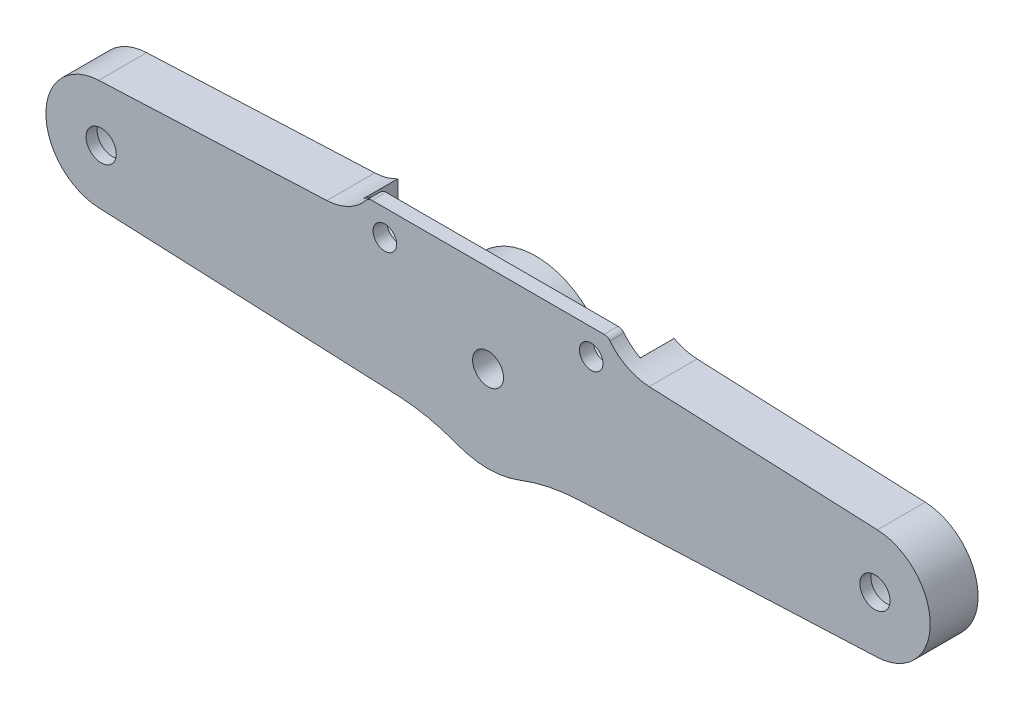
ISO-10303-21;
HEADER;
FILE_DESCRIPTION(('STEP AP214'),'2;1');
FILE_NAME('part.step','',(''),(''),'','','');
FILE_SCHEMA(('AUTOMOTIVE_DESIGN { 1 0 10303 214 1 1 1 1 }'));
ENDSEC;
DATA;
#1=APPLICATION_CONTEXT('core data for automotive mechanical design processes');
#2=APPLICATION_PROTOCOL_DEFINITION('international standard','automotive_design',2000,#1);
#3=PRODUCT_CONTEXT('',#1,'mechanical');
#4=PRODUCT('Part','Part','',(#3));
#5=PRODUCT_RELATED_PRODUCT_CATEGORY('part','',(#4));
#6=PRODUCT_DEFINITION_FORMATION('','',#4);
#7=PRODUCT_DEFINITION_CONTEXT('part definition',#1,'design');
#8=PRODUCT_DEFINITION('design','',#6,#7);
#9=PRODUCT_DEFINITION_SHAPE('','',#8);
#10=(LENGTH_UNIT() NAMED_UNIT(*) SI_UNIT(.MILLI.,.METRE.));
#11=(NAMED_UNIT(*) PLANE_ANGLE_UNIT() SI_UNIT($,.RADIAN.));
#12=(NAMED_UNIT(*) SI_UNIT($,.STERADIAN.) SOLID_ANGLE_UNIT());
#13=UNCERTAINTY_MEASURE_WITH_UNIT(LENGTH_MEASURE(1.E-05),#10,'distance_accuracy_value','');
#14=(GEOMETRIC_REPRESENTATION_CONTEXT(3) GLOBAL_UNCERTAINTY_ASSIGNED_CONTEXT((#13)) GLOBAL_UNIT_ASSIGNED_CONTEXT((#10,
#11,#12)) REPRESENTATION_CONTEXT('',''));
#15=CARTESIAN_POINT('',(0.,0.,0.));
#16=DIRECTION('',(0.,0.,1.));
#17=DIRECTION('',(1.,0.,0.));
#18=AXIS2_PLACEMENT_3D('',#15,#16,#17);
#19=CARTESIAN_POINT('',(0.,189.,-4.06854249492385));
#20=DIRECTION('',(0.,0.,1.));
#21=DIRECTION('',(1.,0.,0.));
#22=AXIS2_PLACEMENT_3D('',#19,#20,#21);
#23=CYLINDRICAL_SURFACE('',#22,17.5);
#24=CARTESIAN_POINT('',(0.,189.,52.5));
#25=DIRECTION('',(0.,0.,1.));
#26=DIRECTION('',(1.,0.,0.));
#27=AXIS2_PLACEMENT_3D('',#24,#25,#26);
#28=CIRCLE('',#27,17.5);
#29=CARTESIAN_POINT('',(17.5,189.,52.5));
#30=VERTEX_POINT('',#29);
#31=EDGE_CURVE('E400',#30,#30,#28,.T.);
#32=ORIENTED_EDGE('',*,*,#31,.F.);
#33=EDGE_LOOP('',(#32));
#34=FACE_BOUND('',#33,.T.);
#35=CARTESIAN_POINT('',(0.,189.,54.5));
#36=DIRECTION('',(0.,0.,1.));
#37=DIRECTION('',(1.,0.,0.));
#38=AXIS2_PLACEMENT_3D('',#35,#36,#37);
#39=CIRCLE('',#38,17.5);
#40=CARTESIAN_POINT('',(17.5,189.,54.5));
#41=VERTEX_POINT('',#40);
#42=EDGE_CURVE('E412',#41,#41,#39,.T.);
#43=ORIENTED_EDGE('',*,*,#42,.T.);
#44=EDGE_LOOP('',(#43));
#45=FACE_BOUND('',#44,.T.);
#46=ADVANCED_FACE('F37',(#34,#45),#23,.F.);
#47=CARTESIAN_POINT('',(0.,190.925,61.7));
#48=DIRECTION('',(0.,0.,-1.));
#49=DIRECTION('',(-1.,0.,0.));
#50=AXIS2_PLACEMENT_3D('',#47,#48,#49);
#51=PLANE('',#50);
#52=CARTESIAN_POINT('',(28.,205.85,61.7));
#53=DIRECTION('',(0.,0.,-1.));
#54=DIRECTION('',(-1.,0.,0.));
#55=AXIS2_PLACEMENT_3D('',#52,#53,#54);
#56=CIRCLE('',#55,3.2);
#57=CARTESIAN_POINT('',(24.8,205.85,61.7));
#58=VERTEX_POINT('',#57);
#59=EDGE_CURVE('E294',#58,#58,#56,.F.);
#60=ORIENTED_EDGE('',*,*,#59,.T.);
#61=EDGE_LOOP('',(#60));
#62=FACE_BOUND('',#61,.T.);
#63=CARTESIAN_POINT('',(-28.,205.85,61.7));
#64=DIRECTION('',(0.,0.,-1.));
#65=DIRECTION('',(-1.,0.,0.));
#66=AXIS2_PLACEMENT_3D('',#63,#64,#65);
#67=CIRCLE('',#66,3.2);
#68=CARTESIAN_POINT('',(-31.2,205.85,61.7));
#69=VERTEX_POINT('',#68);
#70=EDGE_CURVE('E291',#69,#69,#67,.F.);
#71=ORIENTED_EDGE('',*,*,#70,.T.);
#72=EDGE_LOOP('',(#71));
#73=FACE_BOUND('',#72,.T.);
#74=DIRECTION('',(-1.,0.,0.));
#75=VECTOR('',#74,1.);
#76=CARTESIAN_POINT('',(0.,199.35,61.7));
#77=LINE('',#76,#75);
#78=CARTESIAN_POINT('',(33.5,199.35,61.7));
#79=VERTEX_POINT('',#78);
#80=CARTESIAN_POINT('',(17.1136641313309,199.35,61.7));
#81=VERTEX_POINT('',#80);
#82=EDGE_CURVE('E333',#79,#81,#77,.T.);
#83=ORIENTED_EDGE('',*,*,#82,.T.);
#84=CARTESIAN_POINT('',(0.,189.,61.7));
#85=DIRECTION('',(0.,0.,-1.));
#86=DIRECTION('',(-1.,0.,0.));
#87=AXIS2_PLACEMENT_3D('',#84,#85,#86);
#88=CIRCLE('',#87,20.);
#89=CARTESIAN_POINT('',(-17.1136641313309,199.35,61.7));
#90=VERTEX_POINT('',#89);
#91=EDGE_CURVE('E406',#90,#81,#88,.T.);
#92=ORIENTED_EDGE('',*,*,#91,.F.);
#93=DIRECTION('',(-1.,0.,0.));
#94=VECTOR('',#93,1.);
#95=CARTESIAN_POINT('',(0.,199.35,61.7));
#96=LINE('',#95,#94);
#97=CARTESIAN_POINT('',(-33.5,199.35,61.7));
#98=VERTEX_POINT('',#97);
#99=EDGE_CURVE('E331',#90,#98,#96,.T.);
#100=ORIENTED_EDGE('',*,*,#99,.T.);
#101=CARTESIAN_POINT('',(-33.5,203.35,61.7));
#102=DIRECTION('',(0.,0.,1.));
#103=DIRECTION('',(1.,0.,0.));
#104=AXIS2_PLACEMENT_3D('',#101,#102,#103);
#105=CIRCLE('',#104,4.);
#106=CARTESIAN_POINT('',(-37.5,203.35,61.7));
#107=VERTEX_POINT('',#106);
#108=EDGE_CURVE('E198',#98,#107,#105,.F.);
#109=ORIENTED_EDGE('',*,*,#108,.T.);
#110=DIRECTION('',(0.,1.,0.));
#111=VECTOR('',#110,1.);
#112=CARTESIAN_POINT('',(-37.5,190.925,61.7));
#113=LINE('',#112,#111);
#114=CARTESIAN_POINT('',(-37.5000000000001,208.40608142153,61.7));
#115=VERTEX_POINT('',#114);
#116=EDGE_CURVE('E337',#107,#115,#113,.T.);
#117=ORIENTED_EDGE('',*,*,#116,.T.);
#118=CARTESIAN_POINT('',(-44.370078815034,221.175263739722,61.7));
#119=DIRECTION('',(0.,0.,1.));
#120=DIRECTION('',(1.,0.,0.));
#121=AXIS2_PLACEMENT_3D('',#118,#119,#120);
#122=CIRCLE('',#121,14.5);
#123=CARTESIAN_POINT('',(-33.0600095533376,212.101547119966,61.7));
#124=VERTEX_POINT('',#123);
#125=EDGE_CURVE('E326',#115,#124,#122,.T.);
#126=ORIENTED_EDGE('',*,*,#125,.T.);
#127=CARTESIAN_POINT('',(-31.5,210.85,61.7));
#128=DIRECTION('',(0.,0.,1.));
#129=DIRECTION('',(1.,0.,0.));
#130=AXIS2_PLACEMENT_3D('',#127,#128,#129);
#131=CIRCLE('',#130,2.);
#132=CARTESIAN_POINT('',(-31.5,212.85,61.7));
#133=VERTEX_POINT('',#132);
#134=EDGE_CURVE('E328',#133,#124,#131,.T.);
#135=ORIENTED_EDGE('',*,*,#134,.F.);
#136=DIRECTION('',(-1.,0.,0.));
#137=VECTOR('',#136,1.);
#138=CARTESIAN_POINT('',(31.5,212.85,61.7));
#139=LINE('',#138,#137);
#140=CARTESIAN_POINT('',(31.5,212.85,61.7));
#141=VERTEX_POINT('',#140);
#142=EDGE_CURVE('E351',#141,#133,#139,.T.);
#143=ORIENTED_EDGE('',*,*,#142,.F.);
#144=CARTESIAN_POINT('',(31.5,210.85,61.7));
#145=DIRECTION('',(0.,0.,1.));
#146=DIRECTION('',(1.,0.,0.));
#147=AXIS2_PLACEMENT_3D('',#144,#145,#146);
#148=CIRCLE('',#147,2.00000000000001);
#149=CARTESIAN_POINT('',(33.0600095533375,212.101547119966,61.7));
#150=VERTEX_POINT('',#149);
#151=EDGE_CURVE('E297',#150,#141,#148,.T.);
#152=ORIENTED_EDGE('',*,*,#151,.F.);
#153=CARTESIAN_POINT('',(44.370078815034,221.175263739722,61.7));
#154=DIRECTION('',(0.,0.,1.));
#155=DIRECTION('',(1.,0.,0.));
#156=AXIS2_PLACEMENT_3D('',#153,#154,#155);
#157=CIRCLE('',#156,14.5);
#158=CARTESIAN_POINT('',(37.5000000000001,208.40608142153,61.7));
#159=VERTEX_POINT('',#158);
#160=EDGE_CURVE('E300',#150,#159,#157,.T.);
#161=ORIENTED_EDGE('',*,*,#160,.T.);
#162=DIRECTION('',(0.,1.,0.));
#163=VECTOR('',#162,1.);
#164=CARTESIAN_POINT('',(37.5,190.925,61.7));
#165=LINE('',#164,#163);
#166=CARTESIAN_POINT('',(37.5,203.35,61.7));
#167=VERTEX_POINT('',#166);
#168=EDGE_CURVE('E334',#159,#167,#165,.F.);
#169=ORIENTED_EDGE('',*,*,#168,.T.);
#170=CARTESIAN_POINT('',(33.5,203.35,61.7));
#171=DIRECTION('',(0.,0.,1.));
#172=DIRECTION('',(1.,0.,0.));
#173=AXIS2_PLACEMENT_3D('',#170,#171,#172);
#174=CIRCLE('',#173,4.);
#175=EDGE_CURVE('E195',#167,#79,#174,.F.);
#176=ORIENTED_EDGE('',*,*,#175,.T.);
#177=EDGE_LOOP('',(#83,#92,#100,#109,#117,#126,#135,#143,#152,#161,#169,#176));
#178=FACE_BOUND('',#177,.T.);
#179=ADVANCED_FACE('F433',(#62,#73,#178),#51,.T.);
#180=CARTESIAN_POINT('',(105.,189.,62.5));
#181=DIRECTION('',(0.,0.,-1.));
#182=DIRECTION('',(-1.,0.,0.));
#183=AXIS2_PLACEMENT_3D('',#180,#181,#182);
#184=PLANE('',#183);
#185=CARTESIAN_POINT('',(105.,189.,62.5));
#186=DIRECTION('',(0.,0.,-1.));
#187=DIRECTION('',(0.,1.,0.));
#188=AXIS2_PLACEMENT_3D('',#185,#186,#187);
#189=CIRCLE('',#188,4.1);
#190=CARTESIAN_POINT('',(105.,193.1,62.5));
#191=VERTEX_POINT('',#190);
#192=EDGE_CURVE('E288',#191,#191,#189,.F.);
#193=ORIENTED_EDGE('',*,*,#192,.T.);
#194=EDGE_LOOP('',(#193));
#195=FACE_BOUND('',#194,.T.);
#196=CARTESIAN_POINT('',(105.,189.,62.5));
#197=DIRECTION('',(0.,0.,-1.));
#198=DIRECTION('',(-1.,0.,0.));
#199=AXIS2_PLACEMENT_3D('',#196,#197,#198);
#200=CIRCLE('',#199,11.05);
#201=CARTESIAN_POINT('',(93.95,189.,62.5));
#202=VERTEX_POINT('',#201);
#203=EDGE_CURVE('E397',#202,#202,#200,.F.);
#204=ORIENTED_EDGE('',*,*,#203,.F.);
#205=EDGE_LOOP('',(#204));
#206=FACE_BOUND('',#205,.T.);
#207=ADVANCED_FACE('F439',(#195,#206),#184,.T.);
#208=CARTESIAN_POINT('',(-33.5,203.35,52.5));
#209=DIRECTION('',(0.,0.,1.));
#210=DIRECTION('',(1.,0.,0.));
#211=AXIS2_PLACEMENT_3D('',#208,#209,#210);
#212=CYLINDRICAL_SURFACE('',#211,4.);
#213=DIRECTION('',(0.,0.,-1.));
#214=VECTOR('',#213,1.);
#215=CARTESIAN_POINT('',(-33.5,199.35,52.5));
#216=LINE('',#215,#214);
#217=CARTESIAN_POINT('',(-33.5,199.35,52.5));
#218=VERTEX_POINT('',#217);
#219=EDGE_CURVE('E230',#98,#218,#216,.T.);
#220=ORIENTED_EDGE('',*,*,#219,.T.);
#221=CARTESIAN_POINT('',(-33.5,203.35,52.5));
#222=DIRECTION('',(0.,0.,1.));
#223=DIRECTION('',(1.,0.,0.));
#224=AXIS2_PLACEMENT_3D('',#221,#222,#223);
#225=CIRCLE('',#224,4.);
#226=CARTESIAN_POINT('',(-37.5,203.35,52.5));
#227=VERTEX_POINT('',#226);
#228=EDGE_CURVE('E206',#218,#227,#225,.F.);
#229=ORIENTED_EDGE('',*,*,#228,.T.);
#230=DIRECTION('',(0.,0.,1.));
#231=VECTOR('',#230,1.);
#232=CARTESIAN_POINT('',(-37.5,203.35,52.5));
#233=LINE('',#232,#231);
#234=EDGE_CURVE('E190',#227,#107,#233,.T.);
#235=ORIENTED_EDGE('',*,*,#234,.T.);
#236=ORIENTED_EDGE('',*,*,#108,.F.);
#237=EDGE_LOOP('',(#220,#229,#235,#236));
#238=FACE_BOUND('',#237,.T.);
#239=ADVANCED_FACE('F39',(#238),#212,.F.);
#240=CARTESIAN_POINT('',(33.5,203.35,52.5));
#241=DIRECTION('',(0.,0.,1.));
#242=DIRECTION('',(1.,0.,0.));
#243=AXIS2_PLACEMENT_3D('',#240,#241,#242);
#244=CYLINDRICAL_SURFACE('',#243,4.);
#245=DIRECTION('',(0.,0.,1.));
#246=VECTOR('',#245,1.);
#247=CARTESIAN_POINT('',(37.5,203.35,52.5));
#248=LINE('',#247,#246);
#249=CARTESIAN_POINT('',(37.5,203.35,52.5));
#250=VERTEX_POINT('',#249);
#251=EDGE_CURVE('E192',#167,#250,#248,.F.);
#252=ORIENTED_EDGE('',*,*,#251,.T.);
#253=CARTESIAN_POINT('',(33.5,203.35,52.5));
#254=DIRECTION('',(0.,0.,1.));
#255=DIRECTION('',(1.,0.,0.));
#256=AXIS2_PLACEMENT_3D('',#253,#254,#255);
#257=CIRCLE('',#256,4.);
#258=CARTESIAN_POINT('',(33.5,199.35,52.5));
#259=VERTEX_POINT('',#258);
#260=EDGE_CURVE('E177',#250,#259,#257,.F.);
#261=ORIENTED_EDGE('',*,*,#260,.T.);
#262=DIRECTION('',(0.,0.,1.));
#263=VECTOR('',#262,1.);
#264=CARTESIAN_POINT('',(33.5,199.35,52.5));
#265=LINE('',#264,#263);
#266=EDGE_CURVE('E235',#259,#79,#265,.T.);
#267=ORIENTED_EDGE('',*,*,#266,.T.);
#268=ORIENTED_EDGE('',*,*,#175,.F.);
#269=EDGE_LOOP('',(#252,#261,#267,#268));
#270=FACE_BOUND('',#269,.T.);
#271=ADVANCED_FACE('F193',(#270),#244,.F.);
#272=CARTESIAN_POINT('',(17.113664131331,199.35,52.5));
#273=DIRECTION('',(0.,-1.,0.));
#274=DIRECTION('',(1.,0.,0.));
#275=AXIS2_PLACEMENT_3D('',#272,#273,#274);
#276=PLANE('',#275);
#277=DIRECTION('',(1.,0.,0.));
#278=VECTOR('',#277,1.);
#279=CARTESIAN_POINT('',(0.,199.35,52.5));
#280=LINE('',#279,#278);
#281=CARTESIAN_POINT('',(17.1136641313309,199.35,52.5));
#282=VERTEX_POINT('',#281);
#283=EDGE_CURVE('E187',#259,#282,#280,.F.);
#284=ORIENTED_EDGE('',*,*,#283,.T.);
#285=DIRECTION('',(0.,0.,1.));
#286=VECTOR('',#285,1.);
#287=CARTESIAN_POINT('',(17.1136641313309,199.35,52.5));
#288=LINE('',#287,#286);
#289=EDGE_CURVE('E231',#282,#81,#288,.T.);
#290=ORIENTED_EDGE('',*,*,#289,.T.);
#291=ORIENTED_EDGE('',*,*,#82,.F.);
#292=ORIENTED_EDGE('',*,*,#266,.F.);
#293=EDGE_LOOP('',(#284,#290,#291,#292));
#294=FACE_BOUND('',#293,.T.);
#295=ADVANCED_FACE('F548',(#294),#276,.F.);
#296=CARTESIAN_POINT('',(-37.5,199.35,52.5));
#297=DIRECTION('',(0.,-1.,0.));
#298=DIRECTION('',(0.,0.,-1.));
#299=AXIS2_PLACEMENT_3D('',#296,#297,#298);
#300=PLANE('',#299);
#301=ORIENTED_EDGE('',*,*,#99,.F.);
#302=DIRECTION('',(0.,0.,-1.));
#303=VECTOR('',#302,1.);
#304=CARTESIAN_POINT('',(-17.113664131331,199.35,52.5));
#305=LINE('',#304,#303);
#306=CARTESIAN_POINT('',(-17.1136641313308,199.35,52.5));
#307=VERTEX_POINT('',#306);
#308=EDGE_CURVE('E228',#307,#90,#305,.F.);
#309=ORIENTED_EDGE('',*,*,#308,.F.);
#310=DIRECTION('',(1.,0.,0.));
#311=VECTOR('',#310,1.);
#312=CARTESIAN_POINT('',(0.,199.35,52.5));
#313=LINE('',#312,#311);
#314=EDGE_CURVE('E338',#307,#218,#313,.F.);
#315=ORIENTED_EDGE('',*,*,#314,.T.);
#316=ORIENTED_EDGE('',*,*,#219,.F.);
#317=EDGE_LOOP('',(#301,#309,#315,#316));
#318=FACE_BOUND('',#317,.T.);
#319=ADVANCED_FACE('F544',(#318),#300,.F.);
#320=CARTESIAN_POINT('',(-37.5,208.40608142153,52.5));
#321=DIRECTION('',(-1.,0.,0.));
#322=DIRECTION('',(0.,0.,1.));
#323=AXIS2_PLACEMENT_3D('',#320,#321,#322);
#324=PLANE('',#323);
#325=DIRECTION('',(0.,1.,0.));
#326=VECTOR('',#325,1.);
#327=CARTESIAN_POINT('',(-37.5,189.175,52.5));
#328=LINE('',#327,#326);
#329=CARTESIAN_POINT('',(-37.5000000000001,208.40608142153,52.5));
#330=VERTEX_POINT('',#329);
#331=EDGE_CURVE('E204',#227,#330,#328,.T.);
#332=ORIENTED_EDGE('',*,*,#331,.T.);
#333=DIRECTION('',(0.,0.,1.));
#334=VECTOR('',#333,1.);
#335=CARTESIAN_POINT('',(-37.5000000000001,208.40608142153,52.5));
#336=LINE('',#335,#334);
#337=EDGE_CURVE('E224',#330,#115,#336,.T.);
#338=ORIENTED_EDGE('',*,*,#337,.T.);
#339=ORIENTED_EDGE('',*,*,#116,.F.);
#340=ORIENTED_EDGE('',*,*,#234,.F.);
#341=EDGE_LOOP('',(#332,#338,#339,#340));
#342=FACE_BOUND('',#341,.T.);
#343=ADVANCED_FACE('F541',(#342),#324,.F.);
#344=CARTESIAN_POINT('',(0.,189.175,52.5));
#345=DIRECTION('',(0.,0.,1.));
#346=DIRECTION('',(1.,0.,0.));
#347=AXIS2_PLACEMENT_3D('',#344,#345,#346);
#348=PLANE('',#347);
#349=ORIENTED_EDGE('',*,*,#228,.F.);
#350=ORIENTED_EDGE('',*,*,#314,.F.);
#351=CARTESIAN_POINT('',(0.,189.,52.5));
#352=DIRECTION('',(0.,0.,1.));
#353=DIRECTION('',(1.,0.,0.));
#354=AXIS2_PLACEMENT_3D('',#351,#352,#353);
#355=CIRCLE('',#354,20.);
#356=EDGE_CURVE('E403',#282,#307,#355,.T.);
#357=ORIENTED_EDGE('',*,*,#356,.F.);
#358=ORIENTED_EDGE('',*,*,#283,.F.);
#359=ORIENTED_EDGE('',*,*,#260,.F.);
#360=DIRECTION('',(0.,1.,0.));
#361=VECTOR('',#360,1.);
#362=CARTESIAN_POINT('',(37.5,199.35,52.5));
#363=LINE('',#362,#361);
#364=CARTESIAN_POINT('',(37.5,208.40608142153,52.5));
#365=VERTEX_POINT('',#364);
#366=EDGE_CURVE('E183',#250,#365,#363,.T.);
#367=ORIENTED_EDGE('',*,*,#366,.T.);
#368=CARTESIAN_POINT('',(44.370078815034,221.175263739722,52.5));
#369=DIRECTION('',(0.,0.,1.));
#370=DIRECTION('',(1.,0.,0.));
#371=AXIS2_PLACEMENT_3D('',#368,#369,#370);
#372=CIRCLE('',#371,14.5);
#373=CARTESIAN_POINT('',(43.7375976982367,206.689064526785,52.5));
#374=VERTEX_POINT('',#373);
#375=EDGE_CURVE('E304',#365,#374,#372,.T.);
#376=ORIENTED_EDGE('',*,*,#375,.T.);
#377=DIRECTION('',(-0.999048221581858,0.0436193873653286,0.));
#378=VECTOR('',#377,1.);
#379=CARTESIAN_POINT('',(105.65429081048,203.985723323728,52.5));
#380=LINE('',#379,#378);
#381=CARTESIAN_POINT('',(105.65429081048,203.985723323728,52.5));
#382=VERTEX_POINT('',#381);
#383=EDGE_CURVE('E347',#382,#374,#380,.T.);
#384=ORIENTED_EDGE('',*,*,#383,.F.);
#385=CARTESIAN_POINT('',(105.,189.,52.5));
#386=DIRECTION('',(0.,0.,1.));
#387=DIRECTION('',(1.,0.,0.));
#388=AXIS2_PLACEMENT_3D('',#385,#386,#387);
#389=CIRCLE('',#388,15.);
#390=CARTESIAN_POINT('',(105.65429081048,174.014276676272,52.5));
#391=VERTEX_POINT('',#390);
#392=EDGE_CURVE('E214',#391,#382,#389,.T.);
#393=ORIENTED_EDGE('',*,*,#392,.F.);
#394=DIRECTION('',(0.999048221581858,0.0436193873653353,0.));
#395=VECTOR('',#394,1.);
#396=CARTESIAN_POINT('',(13.8367845227019,170.00543777624,52.5));
#397=LINE('',#396,#395);
#398=CARTESIAN_POINT('',(24.5141938105685,170.471623533568,52.5));
#399=VERTEX_POINT('',#398);
#400=EDGE_CURVE('E211',#399,#391,#397,.T.);
#401=ORIENTED_EDGE('',*,*,#400,.F.);
#402=CARTESIAN_POINT('',(26.6951631788352,120.519212454475,52.5));
#403=DIRECTION('',(0.,0.,1.));
#404=DIRECTION('',(1.,0.,0.));
#405=AXIS2_PLACEMENT_3D('',#402,#403,#404);
#406=CIRCLE('',#405,50.);
#407=CARTESIAN_POINT('',(8.53518822724665,167.104782213336,52.5));
#408=VERTEX_POINT('',#407);
#409=EDGE_CURVE('E310',#399,#408,#406,.T.);
#410=ORIENTED_EDGE('',*,*,#409,.T.);
#411=CARTESIAN_POINT('',(0.,189.,52.5));
#412=DIRECTION('',(0.,0.,1.));
#413=DIRECTION('',(1.,0.,0.));
#414=AXIS2_PLACEMENT_3D('',#411,#412,#413);
#415=CIRCLE('',#414,23.4999999999998);
#416=CARTESIAN_POINT('',(-8.53518822724664,167.104782213336,52.5));
#417=VERTEX_POINT('',#416);
#418=EDGE_CURVE('E314',#417,#408,#415,.T.);
#419=ORIENTED_EDGE('',*,*,#418,.F.);
#420=CARTESIAN_POINT('',(-26.6951631788352,120.519212454475,52.5));
#421=DIRECTION('',(0.,0.,1.));
#422=DIRECTION('',(1.,0.,0.));
#423=AXIS2_PLACEMENT_3D('',#420,#421,#422);
#424=CIRCLE('',#423,50.);
#425=CARTESIAN_POINT('',(-24.5141938105685,170.471623533568,52.5));
#426=VERTEX_POINT('',#425);
#427=EDGE_CURVE('E317',#417,#426,#424,.T.);
#428=ORIENTED_EDGE('',*,*,#427,.T.);
#429=DIRECTION('',(0.999048221581858,-0.0436193873653357,0.));
#430=VECTOR('',#429,1.);
#431=CARTESIAN_POINT('',(-105.65429081048,174.014276676272,52.5));
#432=LINE('',#431,#430);
#433=CARTESIAN_POINT('',(-105.65429081048,174.014276676272,52.5));
#434=VERTEX_POINT('',#433);
#435=EDGE_CURVE('E216',#434,#426,#432,.T.);
#436=ORIENTED_EDGE('',*,*,#435,.F.);
#437=CARTESIAN_POINT('',(-105.,189.,52.5));
#438=DIRECTION('',(0.,0.,1.));
#439=DIRECTION('',(1.,0.,0.));
#440=AXIS2_PLACEMENT_3D('',#437,#438,#439);
#441=CIRCLE('',#440,15.);
#442=CARTESIAN_POINT('',(-105.65429081048,203.985723323728,52.5));
#443=VERTEX_POINT('',#442);
#444=EDGE_CURVE('E320',#443,#434,#441,.T.);
#445=ORIENTED_EDGE('',*,*,#444,.F.);
#446=DIRECTION('',(-0.999048221581858,-0.0436193873653279,0.));
#447=VECTOR('',#446,1.);
#448=CARTESIAN_POINT('',(-43.7375976982367,206.689064526785,52.5));
#449=LINE('',#448,#447);
#450=CARTESIAN_POINT('',(-43.7375976982367,206.689064526785,52.5));
#451=VERTEX_POINT('',#450);
#452=EDGE_CURVE('E220',#451,#443,#449,.T.);
#453=ORIENTED_EDGE('',*,*,#452,.F.);
#454=CARTESIAN_POINT('',(-44.370078815034,221.175263739722,52.5));
#455=DIRECTION('',(0.,0.,1.));
#456=DIRECTION('',(1.,0.,0.));
#457=AXIS2_PLACEMENT_3D('',#454,#455,#456);
#458=CIRCLE('',#457,14.5);
#459=EDGE_CURVE('E227',#451,#330,#458,.T.);
#460=ORIENTED_EDGE('',*,*,#459,.T.);
#461=ORIENTED_EDGE('',*,*,#331,.F.);
#462=EDGE_LOOP('',(#349,#350,#357,#358,#359,#367,#376,#384,#393,#401,#410,#419,#428,#436,#445,
#453,#460,#461));
#463=FACE_BOUND('',#462,.T.);
#464=CARTESIAN_POINT('',(-105.,189.,52.5));
#465=DIRECTION('',(0.,0.,-1.));
#466=DIRECTION('',(-1.,0.,0.));
#467=AXIS2_PLACEMENT_3D('',#464,#465,#466);
#468=CIRCLE('',#467,11.05);
#469=CARTESIAN_POINT('',(-116.05,189.,52.5));
#470=VERTEX_POINT('',#469);
#471=EDGE_CURVE('E236',#470,#470,#468,.T.);
#472=ORIENTED_EDGE('',*,*,#471,.F.);
#473=EDGE_LOOP('',(#472));
#474=FACE_BOUND('',#473,.T.);
#475=CARTESIAN_POINT('',(105.,189.,52.5));
#476=DIRECTION('',(0.,0.,-1.));
#477=DIRECTION('',(-1.,0.,0.));
#478=AXIS2_PLACEMENT_3D('',#475,#476,#477);
#479=CIRCLE('',#478,11.05);
#480=CARTESIAN_POINT('',(93.95,189.,52.5));
#481=VERTEX_POINT('',#480);
#482=EDGE_CURVE('E396',#481,#481,#479,.F.);
#483=ORIENTED_EDGE('',*,*,#482,.T.);
#484=EDGE_LOOP('',(#483));
#485=FACE_BOUND('',#484,.T.);
#486=ORIENTED_EDGE('',*,*,#31,.T.);
#487=EDGE_LOOP('',(#486));
#488=FACE_BOUND('',#487,.T.);
#489=ADVANCED_FACE('F180',(#463,#474,#485,#488),#348,.F.);
#490=CARTESIAN_POINT('',(37.5,199.35,52.5));
#491=DIRECTION('',(1.,0.,0.));
#492=DIRECTION('',(0.,1.,0.));
#493=AXIS2_PLACEMENT_3D('',#490,#491,#492);
#494=PLANE('',#493);
#495=ORIENTED_EDGE('',*,*,#168,.F.);
#496=DIRECTION('',(0.,0.,1.));
#497=VECTOR('',#496,1.);
#498=CARTESIAN_POINT('',(37.5000000000001,208.40608142153,52.5));
#499=LINE('',#498,#497);
#500=EDGE_CURVE('E202',#159,#365,#499,.F.);
#501=ORIENTED_EDGE('',*,*,#500,.T.);
#502=ORIENTED_EDGE('',*,*,#366,.F.);
#503=ORIENTED_EDGE('',*,*,#251,.F.);
#504=EDGE_LOOP('',(#495,#501,#502,#503));
#505=FACE_BOUND('',#504,.T.);
#506=ADVANCED_FACE('F200',(#505),#494,.F.);
#507=CARTESIAN_POINT('',(-105.,189.,62.5));
#508=DIRECTION('',(0.,0.,-1.));
#509=DIRECTION('',(-1.,0.,0.));
#510=AXIS2_PLACEMENT_3D('',#507,#508,#509);
#511=PLANE('',#510);
#512=CARTESIAN_POINT('',(-105.,189.,62.5));
#513=DIRECTION('',(0.,0.,-1.));
#514=DIRECTION('',(-1.,0.,0.));
#515=AXIS2_PLACEMENT_3D('',#512,#513,#514);
#516=CIRCLE('',#515,11.05);
#517=CARTESIAN_POINT('',(-116.05,189.,62.5));
#518=VERTEX_POINT('',#517);
#519=EDGE_CURVE('E12',#518,#518,#516,.F.);
#520=ORIENTED_EDGE('',*,*,#519,.F.);
#521=EDGE_LOOP('',(#520));
#522=FACE_BOUND('',#521,.T.);
#523=CARTESIAN_POINT('',(-105.,189.,62.5));
#524=DIRECTION('',(0.,0.,-1.));
#525=DIRECTION('',(0.,1.,0.));
#526=AXIS2_PLACEMENT_3D('',#523,#524,#525);
#527=CIRCLE('',#526,4.1);
#528=CARTESIAN_POINT('',(-105.,193.1,62.5));
#529=VERTEX_POINT('',#528);
#530=EDGE_CURVE('E285',#529,#529,#527,.F.);
#531=ORIENTED_EDGE('',*,*,#530,.T.);
#532=EDGE_LOOP('',(#531));
#533=FACE_BOUND('',#532,.T.);
#534=ADVANCED_FACE('F529',(#522,#533),#511,.T.);
#535=CARTESIAN_POINT('',(-31.5,210.85,52.5));
#536=DIRECTION('',(0.,0.,1.));
#537=DIRECTION('',(1.,0.,0.));
#538=AXIS2_PLACEMENT_3D('',#535,#536,#537);
#539=CYLINDRICAL_SURFACE('',#538,2.);
#540=CARTESIAN_POINT('',(-31.5,210.85,65.5));
#541=DIRECTION('',(0.,0.,1.));
#542=DIRECTION('',(1.,0.,0.));
#543=AXIS2_PLACEMENT_3D('',#540,#541,#542);
#544=CIRCLE('',#543,2.);
#545=CARTESIAN_POINT('',(-31.5,212.85,65.5));
#546=VERTEX_POINT('',#545);
#547=CARTESIAN_POINT('',(-33.0600095533376,212.101547119966,65.5));
#548=VERTEX_POINT('',#547);
#549=EDGE_CURVE('E282',#546,#548,#544,.T.);
#550=ORIENTED_EDGE('',*,*,#549,.F.);
#551=DIRECTION('',(0.,0.,1.));
#552=VECTOR('',#551,1.);
#553=CARTESIAN_POINT('',(-31.5,212.85,52.5));
#554=LINE('',#553,#552);
#555=EDGE_CURVE('E354',#133,#546,#554,.T.);
#556=ORIENTED_EDGE('',*,*,#555,.F.);
#557=ORIENTED_EDGE('',*,*,#134,.T.);
#558=DIRECTION('',(0.,0.,1.));
#559=VECTOR('',#558,1.);
#560=CARTESIAN_POINT('',(-33.0600095533377,212.101547119966,52.5));
#561=LINE('',#560,#559);
#562=EDGE_CURVE('E325',#124,#548,#561,.T.);
#563=ORIENTED_EDGE('',*,*,#562,.T.);
#564=EDGE_LOOP('',(#550,#556,#557,#563));
#565=FACE_BOUND('',#564,.T.);
#566=ADVANCED_FACE('F525',(#565),#539,.T.);
#567=CARTESIAN_POINT('',(-44.370078815034,221.175263739722,52.5));
#568=DIRECTION('',(0.,0.,1.));
#569=DIRECTION('',(1.,0.,0.));
#570=AXIS2_PLACEMENT_3D('',#567,#568,#569);
#571=CYLINDRICAL_SURFACE('',#570,14.5);
#572=ORIENTED_EDGE('',*,*,#459,.F.);
#573=DIRECTION('',(0.,0.,1.));
#574=VECTOR('',#573,1.);
#575=CARTESIAN_POINT('',(-43.7375976982367,206.689064526785,52.5));
#576=LINE('',#575,#574);
#577=CARTESIAN_POINT('',(-43.7375976982367,206.689064526785,65.5));
#578=VERTEX_POINT('',#577);
#579=EDGE_CURVE('E223',#578,#451,#576,.F.);
#580=ORIENTED_EDGE('',*,*,#579,.F.);
#581=CARTESIAN_POINT('',(-44.370078815034,221.175263739722,65.5));
#582=DIRECTION('',(0.,0.,1.));
#583=DIRECTION('',(1.,0.,0.));
#584=AXIS2_PLACEMENT_3D('',#581,#582,#583);
#585=CIRCLE('',#584,14.5);
#586=EDGE_CURVE('E279',#548,#578,#585,.F.);
#587=ORIENTED_EDGE('',*,*,#586,.F.);
#588=ORIENTED_EDGE('',*,*,#562,.F.);
#589=ORIENTED_EDGE('',*,*,#125,.F.);
#590=ORIENTED_EDGE('',*,*,#337,.F.);
#591=EDGE_LOOP('',(#572,#580,#587,#588,#589,#590));
#592=FACE_BOUND('',#591,.T.);
#593=ADVANCED_FACE('F521',(#592),#571,.F.);
#594=CARTESIAN_POINT('',(-43.7375976982367,206.689064526785,52.5));
#595=DIRECTION('',(-0.0436193873653279,0.999048221581858,0.));
#596=DIRECTION('',(-0.999048221581858,-0.0436193873653279,0.));
#597=AXIS2_PLACEMENT_3D('',#594,#595,#596);
#598=PLANE('',#597);
#599=DIRECTION('',(-0.999048221581858,-0.0436193873653274,0.));
#600=VECTOR('',#599,1.);
#601=CARTESIAN_POINT('',(-43.7375976982367,206.689064526785,65.5));
#602=LINE('',#601,#600);
#603=CARTESIAN_POINT('',(-105.65429081048,203.985723323728,65.5));
#604=VERTEX_POINT('',#603);
#605=EDGE_CURVE('E278',#578,#604,#602,.T.);
#606=ORIENTED_EDGE('',*,*,#605,.F.);
#607=ORIENTED_EDGE('',*,*,#579,.T.);
#608=ORIENTED_EDGE('',*,*,#452,.T.);
#609=DIRECTION('',(0.,0.,1.));
#610=VECTOR('',#609,1.);
#611=CARTESIAN_POINT('',(-105.65429081048,203.985723323728,52.5));
#612=LINE('',#611,#610);
#613=EDGE_CURVE('E322',#604,#443,#612,.F.);
#614=ORIENTED_EDGE('',*,*,#613,.F.);
#615=EDGE_LOOP('',(#606,#607,#608,#614));
#616=FACE_BOUND('',#615,.T.);
#617=ADVANCED_FACE('F517',(#616),#598,.T.);
#618=CARTESIAN_POINT('',(-105.,189.,52.5));
#619=DIRECTION('',(0.,0.,1.));
#620=DIRECTION('',(1.,0.,0.));
#621=AXIS2_PLACEMENT_3D('',#618,#619,#620);
#622=CYLINDRICAL_SURFACE('',#621,15.);
#623=CARTESIAN_POINT('',(-105.,189.,65.5));
#624=DIRECTION('',(0.,0.,1.));
#625=DIRECTION('',(1.,0.,0.));
#626=AXIS2_PLACEMENT_3D('',#623,#624,#625);
#627=CIRCLE('',#626,15.);
#628=CARTESIAN_POINT('',(-105.65429081048,174.014276676272,65.5));
#629=VERTEX_POINT('',#628);
#630=EDGE_CURVE('E275',#604,#629,#627,.T.);
#631=ORIENTED_EDGE('',*,*,#630,.F.);
#632=ORIENTED_EDGE('',*,*,#613,.T.);
#633=ORIENTED_EDGE('',*,*,#444,.T.);
#634=DIRECTION('',(0.,0.,1.));
#635=VECTOR('',#634,1.);
#636=CARTESIAN_POINT('',(-105.65429081048,174.014276676272,52.5));
#637=LINE('',#636,#635);
#638=EDGE_CURVE('E219',#629,#434,#637,.F.);
#639=ORIENTED_EDGE('',*,*,#638,.F.);
#640=EDGE_LOOP('',(#631,#632,#633,#639));
#641=FACE_BOUND('',#640,.T.);
#642=ADVANCED_FACE('F513',(#641),#622,.T.);
#643=CARTESIAN_POINT('',(-105.65429081048,174.014276676272,52.5));
#644=DIRECTION('',(-0.0436193873653357,-0.999048221581858,0.));
#645=DIRECTION('',(0.999048221581858,-0.0436193873653357,0.));
#646=AXIS2_PLACEMENT_3D('',#643,#644,#645);
#647=PLANE('',#646);
#648=ORIENTED_EDGE('',*,*,#638,.T.);
#649=ORIENTED_EDGE('',*,*,#435,.T.);
#650=DIRECTION('',(0.,0.,1.));
#651=VECTOR('',#650,1.);
#652=CARTESIAN_POINT('',(-24.5141938105685,170.471623533568,52.5));
#653=LINE('',#652,#651);
#654=CARTESIAN_POINT('',(-24.5141938105685,170.471623533568,65.5));
#655=VERTEX_POINT('',#654);
#656=EDGE_CURVE('E218',#426,#655,#653,.T.);
#657=ORIENTED_EDGE('',*,*,#656,.T.);
#658=DIRECTION('',(0.999048221581858,-0.043619387365333,0.));
#659=VECTOR('',#658,1.);
#660=CARTESIAN_POINT('',(-105.65429081048,174.014276676272,65.5));
#661=LINE('',#660,#659);
#662=EDGE_CURVE('E274',#629,#655,#661,.T.);
#663=ORIENTED_EDGE('',*,*,#662,.F.);
#664=EDGE_LOOP('',(#648,#649,#657,#663));
#665=FACE_BOUND('',#664,.T.);
#666=ADVANCED_FACE('F509',(#665),#647,.T.);
#667=CARTESIAN_POINT('',(-26.6951631788352,120.519212454475,52.5));
#668=DIRECTION('',(0.,0.,1.));
#669=DIRECTION('',(1.,0.,0.));
#670=AXIS2_PLACEMENT_3D('',#667,#668,#669);
#671=CYLINDRICAL_SURFACE('',#670,50.);
#672=DIRECTION('',(0.,0.,1.));
#673=VECTOR('',#672,1.);
#674=CARTESIAN_POINT('',(-8.53518822724671,167.104782213336,52.5));
#675=LINE('',#674,#673);
#676=CARTESIAN_POINT('',(-8.53518822724664,167.104782213336,65.5));
#677=VERTEX_POINT('',#676);
#678=EDGE_CURVE('E316',#677,#417,#675,.F.);
#679=ORIENTED_EDGE('',*,*,#678,.F.);
#680=CARTESIAN_POINT('',(-26.6951631788352,120.519212454475,65.5));
#681=DIRECTION('',(0.,0.,1.));
#682=DIRECTION('',(1.,0.,0.));
#683=AXIS2_PLACEMENT_3D('',#680,#681,#682);
#684=CIRCLE('',#683,50.);
#685=EDGE_CURVE('E271',#655,#677,#684,.F.);
#686=ORIENTED_EDGE('',*,*,#685,.F.);
#687=ORIENTED_EDGE('',*,*,#656,.F.);
#688=ORIENTED_EDGE('',*,*,#427,.F.);
#689=EDGE_LOOP('',(#679,#686,#687,#688));
#690=FACE_BOUND('',#689,.T.);
#691=ADVANCED_FACE('F505',(#690),#671,.F.);
#692=CARTESIAN_POINT('',(0.,189.,52.5));
#693=DIRECTION('',(0.,0.,1.));
#694=DIRECTION('',(1.,0.,0.));
#695=AXIS2_PLACEMENT_3D('',#692,#693,#694);
#696=CYLINDRICAL_SURFACE('',#695,23.4999999999998);
#697=ORIENTED_EDGE('',*,*,#678,.T.);
#698=ORIENTED_EDGE('',*,*,#418,.T.);
#699=DIRECTION('',(0.,0.,1.));
#700=VECTOR('',#699,1.);
#701=CARTESIAN_POINT('',(8.53518822724672,167.104782213336,52.5));
#702=LINE('',#701,#700);
#703=CARTESIAN_POINT('',(8.53518822724665,167.104782213336,65.5));
#704=VERTEX_POINT('',#703);
#705=EDGE_CURVE('E313',#408,#704,#702,.T.);
#706=ORIENTED_EDGE('',*,*,#705,.T.);
#707=CARTESIAN_POINT('',(0.,189.,65.5));
#708=DIRECTION('',(0.,0.,1.));
#709=DIRECTION('',(1.,0.,0.));
#710=AXIS2_PLACEMENT_3D('',#707,#708,#709);
#711=CIRCLE('',#710,23.4999999999998);
#712=EDGE_CURVE('E268',#677,#704,#711,.T.);
#713=ORIENTED_EDGE('',*,*,#712,.F.);
#714=EDGE_LOOP('',(#697,#698,#706,#713));
#715=FACE_BOUND('',#714,.T.);
#716=ADVANCED_FACE('F501',(#715),#696,.T.);
#717=CARTESIAN_POINT('',(26.6951631788352,120.519212454475,52.5));
#718=DIRECTION('',(0.,0.,1.));
#719=DIRECTION('',(1.,0.,0.));
#720=AXIS2_PLACEMENT_3D('',#717,#718,#719);
#721=CYLINDRICAL_SURFACE('',#720,50.);
#722=DIRECTION('',(0.,0.,1.));
#723=VECTOR('',#722,1.);
#724=CARTESIAN_POINT('',(24.5141938105685,170.471623533568,52.5));
#725=LINE('',#724,#723);
#726=CARTESIAN_POINT('',(24.5141938105685,170.471623533568,65.5));
#727=VERTEX_POINT('',#726);
#728=EDGE_CURVE('E215',#727,#399,#725,.F.);
#729=ORIENTED_EDGE('',*,*,#728,.F.);
#730=CARTESIAN_POINT('',(26.6951631788352,120.519212454475,65.5));
#731=DIRECTION('',(0.,0.,1.));
#732=DIRECTION('',(1.,0.,0.));
#733=AXIS2_PLACEMENT_3D('',#730,#731,#732);
#734=CIRCLE('',#733,50.);
#735=EDGE_CURVE('E265',#704,#727,#734,.F.);
#736=ORIENTED_EDGE('',*,*,#735,.F.);
#737=ORIENTED_EDGE('',*,*,#705,.F.);
#738=ORIENTED_EDGE('',*,*,#409,.F.);
#739=EDGE_LOOP('',(#729,#736,#737,#738));
#740=FACE_BOUND('',#739,.T.);
#741=ADVANCED_FACE('F497',(#740),#721,.F.);
#742=CARTESIAN_POINT('',(13.8367845227019,170.00543777624,52.5));
#743=DIRECTION('',(0.0436193873653353,-0.999048221581858,0.));
#744=DIRECTION('',(0.999048221581858,0.0436193873653353,0.));
#745=AXIS2_PLACEMENT_3D('',#742,#743,#744);
#746=PLANE('',#745);
#747=DIRECTION('',(0.,0.,1.));
#748=VECTOR('',#747,1.);
#749=CARTESIAN_POINT('',(105.65429081048,174.014276676272,52.5));
#750=LINE('',#749,#748);
#751=CARTESIAN_POINT('',(105.65429081048,174.014276676272,65.5));
#752=VERTEX_POINT('',#751);
#753=EDGE_CURVE('E309',#752,#391,#750,.F.);
#754=ORIENTED_EDGE('',*,*,#753,.F.);
#755=DIRECTION('',(0.999048221581858,0.043619387365333,0.));
#756=VECTOR('',#755,1.);
#757=CARTESIAN_POINT('',(24.5141938105685,170.471623533568,65.5));
#758=LINE('',#757,#756);
#759=EDGE_CURVE('E264',#727,#752,#758,.T.);
#760=ORIENTED_EDGE('',*,*,#759,.F.);
#761=ORIENTED_EDGE('',*,*,#728,.T.);
#762=ORIENTED_EDGE('',*,*,#400,.T.);
#763=EDGE_LOOP('',(#754,#760,#761,#762));
#764=FACE_BOUND('',#763,.T.);
#765=ADVANCED_FACE('F493',(#764),#746,.T.);
#766=CARTESIAN_POINT('',(105.,189.,52.5));
#767=DIRECTION('',(0.,0.,1.));
#768=DIRECTION('',(1.,0.,0.));
#769=AXIS2_PLACEMENT_3D('',#766,#767,#768);
#770=CYLINDRICAL_SURFACE('',#769,15.);
#771=CARTESIAN_POINT('',(105.,189.,65.5));
#772=DIRECTION('',(0.,0.,1.));
#773=DIRECTION('',(1.,0.,0.));
#774=AXIS2_PLACEMENT_3D('',#771,#772,#773);
#775=CIRCLE('',#774,15.);
#776=CARTESIAN_POINT('',(105.65429081048,203.985723323728,65.5));
#777=VERTEX_POINT('',#776);
#778=EDGE_CURVE('E261',#752,#777,#775,.T.);
#779=ORIENTED_EDGE('',*,*,#778,.F.);
#780=ORIENTED_EDGE('',*,*,#753,.T.);
#781=ORIENTED_EDGE('',*,*,#392,.T.);
#782=DIRECTION('',(0.,0.,1.));
#783=VECTOR('',#782,1.);
#784=CARTESIAN_POINT('',(105.65429081048,203.985723323728,52.5));
#785=LINE('',#784,#783);
#786=EDGE_CURVE('E306',#777,#382,#785,.F.);
#787=ORIENTED_EDGE('',*,*,#786,.F.);
#788=EDGE_LOOP('',(#779,#780,#781,#787));
#789=FACE_BOUND('',#788,.T.);
#790=ADVANCED_FACE('F489',(#789),#770,.T.);
#791=CARTESIAN_POINT('',(105.65429081048,203.985723323728,52.5));
#792=DIRECTION('',(0.0436193873653286,0.999048221581858,0.));
#793=DIRECTION('',(-0.999048221581858,0.0436193873653286,0.));
#794=AXIS2_PLACEMENT_3D('',#791,#792,#793);
#795=PLANE('',#794);
#796=DIRECTION('',(-0.999048221581858,0.0436193873653274,0.));
#797=VECTOR('',#796,1.);
#798=CARTESIAN_POINT('',(105.65429081048,203.985723323728,65.5));
#799=LINE('',#798,#797);
#800=CARTESIAN_POINT('',(43.7375976982367,206.689064526785,65.5));
#801=VERTEX_POINT('',#800);
#802=EDGE_CURVE('E260',#777,#801,#799,.T.);
#803=ORIENTED_EDGE('',*,*,#802,.F.);
#804=ORIENTED_EDGE('',*,*,#786,.T.);
#805=ORIENTED_EDGE('',*,*,#383,.T.);
#806=DIRECTION('',(0.,0.,1.));
#807=VECTOR('',#806,1.);
#808=CARTESIAN_POINT('',(43.7375976982367,206.689064526785,52.5));
#809=LINE('',#808,#807);
#810=EDGE_CURVE('E303',#374,#801,#809,.T.);
#811=ORIENTED_EDGE('',*,*,#810,.T.);
#812=EDGE_LOOP('',(#803,#804,#805,#811));
#813=FACE_BOUND('',#812,.T.);
#814=ADVANCED_FACE('F485',(#813),#795,.T.);
#815=CARTESIAN_POINT('',(44.370078815034,221.175263739722,52.5));
#816=DIRECTION('',(0.,0.,1.));
#817=DIRECTION('',(1.,0.,0.));
#818=AXIS2_PLACEMENT_3D('',#815,#816,#817);
#819=CYLINDRICAL_SURFACE('',#818,14.5);
#820=ORIENTED_EDGE('',*,*,#160,.F.);
#821=DIRECTION('',(0.,0.,1.));
#822=VECTOR('',#821,1.);
#823=CARTESIAN_POINT('',(33.0600095533376,212.101547119966,52.5));
#824=LINE('',#823,#822);
#825=CARTESIAN_POINT('',(33.0600095533375,212.101547119966,65.5));
#826=VERTEX_POINT('',#825);
#827=EDGE_CURVE('E299',#826,#150,#824,.F.);
#828=ORIENTED_EDGE('',*,*,#827,.F.);
#829=CARTESIAN_POINT('',(44.370078815034,221.175263739722,65.5));
#830=DIRECTION('',(0.,0.,1.));
#831=DIRECTION('',(1.,0.,0.));
#832=AXIS2_PLACEMENT_3D('',#829,#830,#831);
#833=CIRCLE('',#832,14.5);
#834=EDGE_CURVE('E257',#801,#826,#833,.F.);
#835=ORIENTED_EDGE('',*,*,#834,.F.);
#836=ORIENTED_EDGE('',*,*,#810,.F.);
#837=ORIENTED_EDGE('',*,*,#375,.F.);
#838=ORIENTED_EDGE('',*,*,#500,.F.);
#839=EDGE_LOOP('',(#820,#828,#835,#836,#837,#838));
#840=FACE_BOUND('',#839,.T.);
#841=ADVANCED_FACE('F482',(#840),#819,.F.);
#842=CARTESIAN_POINT('',(31.5,210.85,52.5));
#843=DIRECTION('',(0.,0.,1.));
#844=DIRECTION('',(1.,0.,0.));
#845=AXIS2_PLACEMENT_3D('',#842,#843,#844);
#846=CYLINDRICAL_SURFACE('',#845,2.00000000000001);
#847=CARTESIAN_POINT('',(31.5,210.85,65.5));
#848=DIRECTION('',(0.,0.,1.));
#849=DIRECTION('',(1.,0.,0.));
#850=AXIS2_PLACEMENT_3D('',#847,#848,#849);
#851=CIRCLE('',#850,2.00000000000001);
#852=CARTESIAN_POINT('',(31.5,212.85,65.5));
#853=VERTEX_POINT('',#852);
#854=EDGE_CURVE('E254',#826,#853,#851,.T.);
#855=ORIENTED_EDGE('',*,*,#854,.F.);
#856=ORIENTED_EDGE('',*,*,#827,.T.);
#857=ORIENTED_EDGE('',*,*,#151,.T.);
#858=DIRECTION('',(0.,0.,1.));
#859=VECTOR('',#858,1.);
#860=CARTESIAN_POINT('',(31.5,212.85,52.5));
#861=LINE('',#860,#859);
#862=EDGE_CURVE('E54',#853,#141,#861,.F.);
#863=ORIENTED_EDGE('',*,*,#862,.F.);
#864=EDGE_LOOP('',(#855,#856,#857,#863));
#865=FACE_BOUND('',#864,.T.);
#866=ADVANCED_FACE('F478',(#865),#846,.T.);
#867=CARTESIAN_POINT('',(31.5,212.85,52.5));
#868=DIRECTION('',(0.,1.,0.));
#869=DIRECTION('',(-1.,0.,0.));
#870=AXIS2_PLACEMENT_3D('',#867,#868,#869);
#871=PLANE('',#870);
#872=DIRECTION('',(1.,0.,0.));
#873=VECTOR('',#872,1.);
#874=CARTESIAN_POINT('',(0.,212.85,65.5));
#875=LINE('',#874,#873);
#876=EDGE_CURVE('E253',#853,#546,#875,.F.);
#877=ORIENTED_EDGE('',*,*,#876,.F.);
#878=ORIENTED_EDGE('',*,*,#862,.T.);
#879=ORIENTED_EDGE('',*,*,#142,.T.);
#880=ORIENTED_EDGE('',*,*,#555,.T.);
#881=EDGE_LOOP('',(#877,#878,#879,#880));
#882=FACE_BOUND('',#881,.T.);
#883=ADVANCED_FACE('F474',(#882),#871,.T.);
#884=CARTESIAN_POINT('',(0.,189.,63.287));
#885=DIRECTION('',(0.,0.,-1.));
#886=DIRECTION('',(-1.,0.,0.));
#887=AXIS2_PLACEMENT_3D('',#884,#885,#886);
#888=CYLINDRICAL_SURFACE('',#887,4.2);
#889=CARTESIAN_POINT('',(0.,189.,65.5));
#890=DIRECTION('',(0.,0.,-1.));
#891=DIRECTION('',(-1.,0.,0.));
#892=AXIS2_PLACEMENT_3D('',#889,#890,#891);
#893=CIRCLE('',#892,4.2);
#894=CARTESIAN_POINT('',(-4.2,189.,65.5));
#895=VERTEX_POINT('',#894);
#896=EDGE_CURVE('E250',#895,#895,#893,.T.);
#897=ORIENTED_EDGE('',*,*,#896,.F.);
#898=EDGE_LOOP('',(#897));
#899=FACE_BOUND('',#898,.T.);
#900=CARTESIAN_POINT('',(0.,189.,54.5));
#901=DIRECTION('',(0.,0.,1.));
#902=DIRECTION('',(1.,0.,0.));
#903=AXIS2_PLACEMENT_3D('',#900,#901,#902);
#904=CIRCLE('',#903,4.2);
#905=CARTESIAN_POINT('',(4.2,189.,54.5));
#906=VERTEX_POINT('',#905);
#907=EDGE_CURVE('E409',#906,#906,#904,.F.);
#908=ORIENTED_EDGE('',*,*,#907,.T.);
#909=EDGE_LOOP('',(#908));
#910=FACE_BOUND('',#909,.T.);
#911=ADVANCED_FACE('F418',(#899,#910),#888,.F.);
#912=CARTESIAN_POINT('',(28.,205.85,62.11));
#913=DIRECTION('',(0.,0.,-1.));
#914=DIRECTION('',(-1.,0.,0.));
#915=AXIS2_PLACEMENT_3D('',#912,#913,#914);
#916=CYLINDRICAL_SURFACE('',#915,3.2);
#917=ORIENTED_EDGE('',*,*,#59,.F.);
#918=EDGE_LOOP('',(#917));
#919=FACE_BOUND('',#918,.T.);
#920=CARTESIAN_POINT('',(28.,205.85,65.5));
#921=DIRECTION('',(0.,0.,-1.));
#922=DIRECTION('',(-1.,0.,0.));
#923=AXIS2_PLACEMENT_3D('',#920,#921,#922);
#924=CIRCLE('',#923,3.2);
#925=CARTESIAN_POINT('',(24.8,205.85,65.5));
#926=VERTEX_POINT('',#925);
#927=EDGE_CURVE('E247',#926,#926,#924,.T.);
#928=ORIENTED_EDGE('',*,*,#927,.F.);
#929=EDGE_LOOP('',(#928));
#930=FACE_BOUND('',#929,.T.);
#931=ADVANCED_FACE('F467',(#919,#930),#916,.F.);
#932=CARTESIAN_POINT('',(-28.,205.85,62.11));
#933=DIRECTION('',(0.,0.,-1.));
#934=DIRECTION('',(-1.,0.,0.));
#935=AXIS2_PLACEMENT_3D('',#932,#933,#934);
#936=CYLINDRICAL_SURFACE('',#935,3.2);
#937=ORIENTED_EDGE('',*,*,#70,.F.);
#938=EDGE_LOOP('',(#937));
#939=FACE_BOUND('',#938,.T.);
#940=CARTESIAN_POINT('',(-28.,205.85,65.5));
#941=DIRECTION('',(0.,0.,-1.));
#942=DIRECTION('',(-1.,0.,0.));
#943=AXIS2_PLACEMENT_3D('',#940,#941,#942);
#944=CIRCLE('',#943,3.2);
#945=CARTESIAN_POINT('',(-31.2,205.85,65.5));
#946=VERTEX_POINT('',#945);
#947=EDGE_CURVE('E244',#946,#946,#944,.T.);
#948=ORIENTED_EDGE('',*,*,#947,.F.);
#949=EDGE_LOOP('',(#948));
#950=FACE_BOUND('',#949,.T.);
#951=ADVANCED_FACE('F463',(#939,#950),#936,.F.);
#952=CARTESIAN_POINT('',(105.,189.,75.495));
#953=DIRECTION('',(0.,0.,-1.));
#954=DIRECTION('',(0.,1.,0.));
#955=AXIS2_PLACEMENT_3D('',#952,#953,#954);
#956=CYLINDRICAL_SURFACE('',#955,4.1);
#957=ORIENTED_EDGE('',*,*,#192,.F.);
#958=EDGE_LOOP('',(#957));
#959=FACE_BOUND('',#958,.T.);
#960=CARTESIAN_POINT('',(105.,189.,65.5));
#961=DIRECTION('',(0.,0.,-1.));
#962=DIRECTION('',(0.,1.,0.));
#963=AXIS2_PLACEMENT_3D('',#960,#961,#962);
#964=CIRCLE('',#963,4.1);
#965=CARTESIAN_POINT('',(105.,193.1,65.5));
#966=VERTEX_POINT('',#965);
#967=EDGE_CURVE('E241',#966,#966,#964,.T.);
#968=ORIENTED_EDGE('',*,*,#967,.F.);
#969=EDGE_LOOP('',(#968));
#970=FACE_BOUND('',#969,.T.);
#971=ADVANCED_FACE('F459',(#959,#970),#956,.F.);
#972=CARTESIAN_POINT('',(-105.,189.,75.495));
#973=DIRECTION('',(0.,0.,-1.));
#974=DIRECTION('',(0.,1.,0.));
#975=AXIS2_PLACEMENT_3D('',#972,#973,#974);
#976=CYLINDRICAL_SURFACE('',#975,4.1);
#977=ORIENTED_EDGE('',*,*,#530,.F.);
#978=EDGE_LOOP('',(#977));
#979=FACE_BOUND('',#978,.T.);
#980=CARTESIAN_POINT('',(-105.,189.,65.5));
#981=DIRECTION('',(0.,0.,-1.));
#982=DIRECTION('',(0.,1.,0.));
#983=AXIS2_PLACEMENT_3D('',#980,#981,#982);
#984=CIRCLE('',#983,4.1);
#985=CARTESIAN_POINT('',(-105.,193.1,65.5));
#986=VERTEX_POINT('',#985);
#987=EDGE_CURVE('E46',#986,#986,#984,.T.);
#988=ORIENTED_EDGE('',*,*,#987,.F.);
#989=EDGE_LOOP('',(#988));
#990=FACE_BOUND('',#989,.T.);
#991=ADVANCED_FACE('F455',(#979,#990),#976,.F.);
#992=CARTESIAN_POINT('',(0.,189.175,65.5));
#993=DIRECTION('',(0.,0.,1.));
#994=DIRECTION('',(1.,0.,0.));
#995=AXIS2_PLACEMENT_3D('',#992,#993,#994);
#996=PLANE('',#995);
#997=ORIENTED_EDGE('',*,*,#987,.T.);
#998=EDGE_LOOP('',(#997));
#999=FACE_BOUND('',#998,.T.);
#1000=ORIENTED_EDGE('',*,*,#967,.T.);
#1001=EDGE_LOOP('',(#1000));
#1002=FACE_BOUND('',#1001,.T.);
#1003=ORIENTED_EDGE('',*,*,#947,.T.);
#1004=EDGE_LOOP('',(#1003));
#1005=FACE_BOUND('',#1004,.T.);
#1006=ORIENTED_EDGE('',*,*,#927,.T.);
#1007=EDGE_LOOP('',(#1006));
#1008=FACE_BOUND('',#1007,.T.);
#1009=ORIENTED_EDGE('',*,*,#896,.T.);
#1010=EDGE_LOOP('',(#1009));
#1011=FACE_BOUND('',#1010,.T.);
#1012=ORIENTED_EDGE('',*,*,#854,.T.);
#1013=ORIENTED_EDGE('',*,*,#876,.T.);
#1014=ORIENTED_EDGE('',*,*,#549,.T.);
#1015=ORIENTED_EDGE('',*,*,#586,.T.);
#1016=ORIENTED_EDGE('',*,*,#605,.T.);
#1017=ORIENTED_EDGE('',*,*,#630,.T.);
#1018=ORIENTED_EDGE('',*,*,#662,.T.);
#1019=ORIENTED_EDGE('',*,*,#685,.T.);
#1020=ORIENTED_EDGE('',*,*,#712,.T.);
#1021=ORIENTED_EDGE('',*,*,#735,.T.);
#1022=ORIENTED_EDGE('',*,*,#759,.T.);
#1023=ORIENTED_EDGE('',*,*,#778,.T.);
#1024=ORIENTED_EDGE('',*,*,#802,.T.);
#1025=ORIENTED_EDGE('',*,*,#834,.T.);
#1026=EDGE_LOOP('',(#1012,#1013,#1014,#1015,#1016,#1017,#1018,#1019,#1020,#1021,#1022,#1023,
#1024,#1025));
#1027=FACE_BOUND('',#1026,.T.);
#1028=ADVANCED_FACE('F451',(#999,#1002,#1005,#1008,#1011,#1027),#996,.T.);
#1029=CARTESIAN_POINT('',(-105.,189.,52.5));
#1030=DIRECTION('',(0.,0.,1.));
#1031=DIRECTION('',(1.,0.,0.));
#1032=AXIS2_PLACEMENT_3D('',#1029,#1030,#1031);
#1033=CYLINDRICAL_SURFACE('',#1032,11.05);
#1034=ORIENTED_EDGE('',*,*,#471,.T.);
#1035=EDGE_LOOP('',(#1034));
#1036=FACE_BOUND('',#1035,.T.);
#1037=ORIENTED_EDGE('',*,*,#519,.T.);
#1038=EDGE_LOOP('',(#1037));
#1039=FACE_BOUND('',#1038,.T.);
#1040=ADVANCED_FACE('F447',(#1036,#1039),#1033,.F.);
#1041=CARTESIAN_POINT('',(105.,189.,52.5));
#1042=DIRECTION('',(0.,0.,1.));
#1043=DIRECTION('',(1.,0.,0.));
#1044=AXIS2_PLACEMENT_3D('',#1041,#1042,#1043);
#1045=CYLINDRICAL_SURFACE('',#1044,11.05);
#1046=ORIENTED_EDGE('',*,*,#482,.F.);
#1047=EDGE_LOOP('',(#1046));
#1048=FACE_BOUND('',#1047,.T.);
#1049=ORIENTED_EDGE('',*,*,#203,.T.);
#1050=EDGE_LOOP('',(#1049));
#1051=FACE_BOUND('',#1050,.T.);
#1052=ADVANCED_FACE('F428',(#1048,#1051),#1045,.F.);
#1053=CARTESIAN_POINT('',(0.,189.,-4.06854249492385));
#1054=DIRECTION('',(0.,0.,1.));
#1055=DIRECTION('',(1.,0.,0.));
#1056=AXIS2_PLACEMENT_3D('',#1053,#1054,#1055);
#1057=CYLINDRICAL_SURFACE('',#1056,20.);
#1058=ORIENTED_EDGE('',*,*,#91,.T.);
#1059=ORIENTED_EDGE('',*,*,#289,.F.);
#1060=ORIENTED_EDGE('',*,*,#356,.T.);
#1061=ORIENTED_EDGE('',*,*,#308,.T.);
#1062=EDGE_LOOP('',(#1058,#1059,#1060,#1061));
#1063=FACE_BOUND('',#1062,.T.);
#1064=ADVANCED_FACE('F422',(#1063),#1057,.T.);
#1065=CARTESIAN_POINT('',(0.,189.175,54.5));
#1066=DIRECTION('',(0.,0.,1.));
#1067=DIRECTION('',(1.,0.,0.));
#1068=AXIS2_PLACEMENT_3D('',#1065,#1066,#1067);
#1069=PLANE('',#1068);
#1070=ORIENTED_EDGE('',*,*,#42,.F.);
#1071=EDGE_LOOP('',(#1070));
#1072=FACE_BOUND('',#1071,.T.);
#1073=ORIENTED_EDGE('',*,*,#907,.F.);
#1074=EDGE_LOOP('',(#1073));
#1075=FACE_BOUND('',#1074,.T.);
#1076=ADVANCED_FACE('F420',(#1072,#1075),#1069,.F.);
#1077=CLOSED_SHELL('',(#46,#179,#207,#239,#271,#295,#319,#343,#489,#506,#534,#566,#593,#617,
#642,#666,#691,#716,#741,#765,#790,#814,#841,#866,#883,#911,#931,#951,#971,#991,#1028,#1040,
#1052,#1064,#1076));
#1078=MANIFOLD_SOLID_BREP('B2',#1077);
#1079=ADVANCED_BREP_SHAPE_REPRESENTATION('',(#18,#1078),#14);
#1080=SHAPE_DEFINITION_REPRESENTATION(#9,#1079);
ENDSEC;
END-ISO-10303-21;
